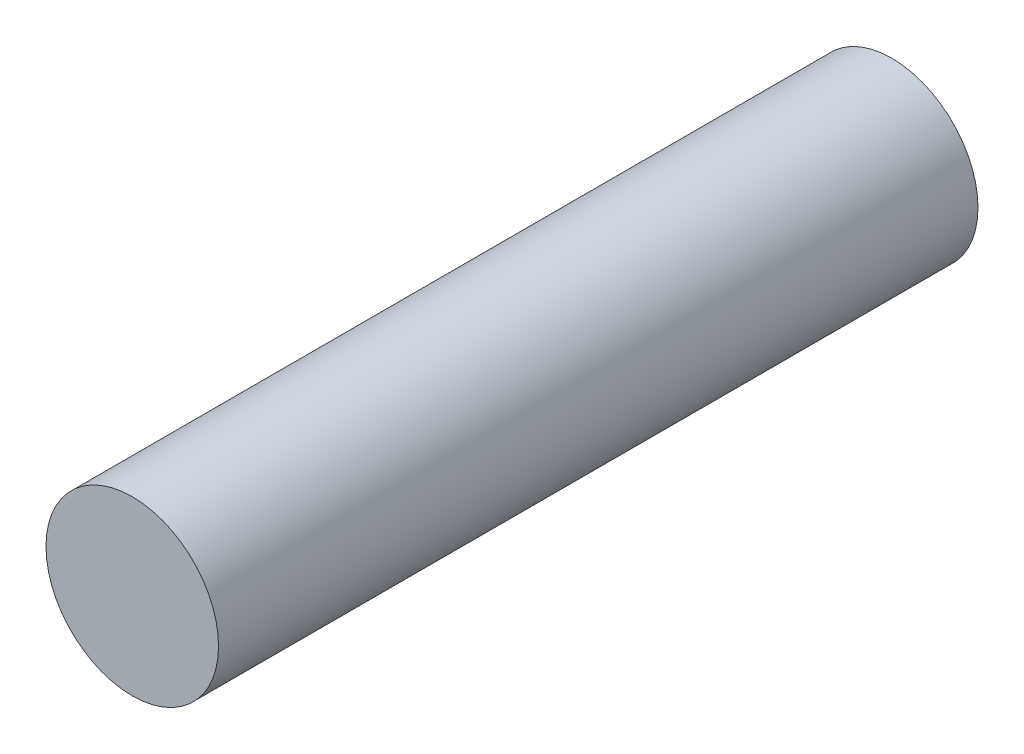
ISO-10303-21;
HEADER;
FILE_DESCRIPTION(('STEP AP214'),'2;1');
FILE_NAME('part.step','',(''),(''),'','','');
FILE_SCHEMA(('AUTOMOTIVE_DESIGN { 1 0 10303 214 1 1 1 1 }'));
ENDSEC;
DATA;
#1=APPLICATION_CONTEXT('core data for automotive mechanical design processes');
#2=APPLICATION_PROTOCOL_DEFINITION('international standard','automotive_design',2000,#1);
#3=PRODUCT_CONTEXT('',#1,'mechanical');
#4=PRODUCT('Part','Part','',(#3));
#5=PRODUCT_RELATED_PRODUCT_CATEGORY('part','',(#4));
#6=PRODUCT_DEFINITION_FORMATION('','',#4);
#7=PRODUCT_DEFINITION_CONTEXT('part definition',#1,'design');
#8=PRODUCT_DEFINITION('design','',#6,#7);
#9=PRODUCT_DEFINITION_SHAPE('','',#8);
#10=(LENGTH_UNIT() NAMED_UNIT(*) SI_UNIT(.MILLI.,.METRE.));
#11=(NAMED_UNIT(*) PLANE_ANGLE_UNIT() SI_UNIT($,.RADIAN.));
#12=(NAMED_UNIT(*) SI_UNIT($,.STERADIAN.) SOLID_ANGLE_UNIT());
#13=UNCERTAINTY_MEASURE_WITH_UNIT(LENGTH_MEASURE(1.E-05),#10,'distance_accuracy_value','');
#14=(GEOMETRIC_REPRESENTATION_CONTEXT(3) GLOBAL_UNCERTAINTY_ASSIGNED_CONTEXT((#13)) GLOBAL_UNIT_ASSIGNED_CONTEXT((#10,
#11,#12)) REPRESENTATION_CONTEXT('',''));
#15=CARTESIAN_POINT('',(0.,0.,0.));
#16=DIRECTION('',(0.,0.,1.));
#17=DIRECTION('',(1.,0.,0.));
#18=AXIS2_PLACEMENT_3D('',#15,#16,#17);
#19=CARTESIAN_POINT('',(0.,0.,35.));
#20=DIRECTION('',(0.,0.,-1.));
#21=DIRECTION('',(-1.,0.,0.));
#22=AXIS2_PLACEMENT_3D('',#19,#20,#21);
#23=CYLINDRICAL_SURFACE('',#22,3.975);
#24=CARTESIAN_POINT('',(0.,0.,35.));
#25=DIRECTION('',(0.,0.,1.));
#26=DIRECTION('',(1.,0.,0.));
#27=AXIS2_PLACEMENT_3D('',#24,#25,#26);
#28=CIRCLE('',#27,3.975);
#29=CARTESIAN_POINT('',(3.975,0.,35.));
#30=VERTEX_POINT('',#29);
#31=EDGE_CURVE('E10',#30,#30,#28,.T.);
#32=ORIENTED_EDGE('',*,*,#31,.F.);
#33=EDGE_LOOP('',(#32));
#34=FACE_BOUND('',#33,.T.);
#35=CARTESIAN_POINT('',(0.,0.,0.));
#36=DIRECTION('',(0.,0.,1.));
#37=DIRECTION('',(1.,0.,0.));
#38=AXIS2_PLACEMENT_3D('',#35,#36,#37);
#39=CIRCLE('',#38,3.975);
#40=CARTESIAN_POINT('',(3.975,0.,0.));
#41=VERTEX_POINT('',#40);
#42=EDGE_CURVE('E33',#41,#41,#39,.T.);
#43=ORIENTED_EDGE('',*,*,#42,.T.);
#44=EDGE_LOOP('',(#43));
#45=FACE_BOUND('',#44,.T.);
#46=ADVANCED_FACE('F30',(#34,#45),#23,.T.);
#47=CARTESIAN_POINT('',(0.,0.,35.));
#48=DIRECTION('',(0.,0.,1.));
#49=DIRECTION('',(1.,0.,0.));
#50=AXIS2_PLACEMENT_3D('',#47,#48,#49);
#51=PLANE('',#50);
#52=ORIENTED_EDGE('',*,*,#31,.T.);
#53=EDGE_LOOP('',(#52));
#54=FACE_BOUND('',#53,.T.);
#55=ADVANCED_FACE('F45',(#54),#51,.T.);
#56=CARTESIAN_POINT('',(0.,0.,0.));
#57=DIRECTION('',(0.,0.,1.));
#58=DIRECTION('',(1.,0.,0.));
#59=AXIS2_PLACEMENT_3D('',#56,#57,#58);
#60=PLANE('',#59);
#61=ORIENTED_EDGE('',*,*,#42,.F.);
#62=EDGE_LOOP('',(#61));
#63=FACE_BOUND('',#62,.T.);
#64=ADVANCED_FACE('F43',(#63),#60,.F.);
#65=CLOSED_SHELL('',(#46,#55,#64));
#66=MANIFOLD_SOLID_BREP('B2',#65);
#67=ADVANCED_BREP_SHAPE_REPRESENTATION('',(#18,#66),#14);
#68=SHAPE_DEFINITION_REPRESENTATION(#9,#67);
ENDSEC;
END-ISO-10303-21;
